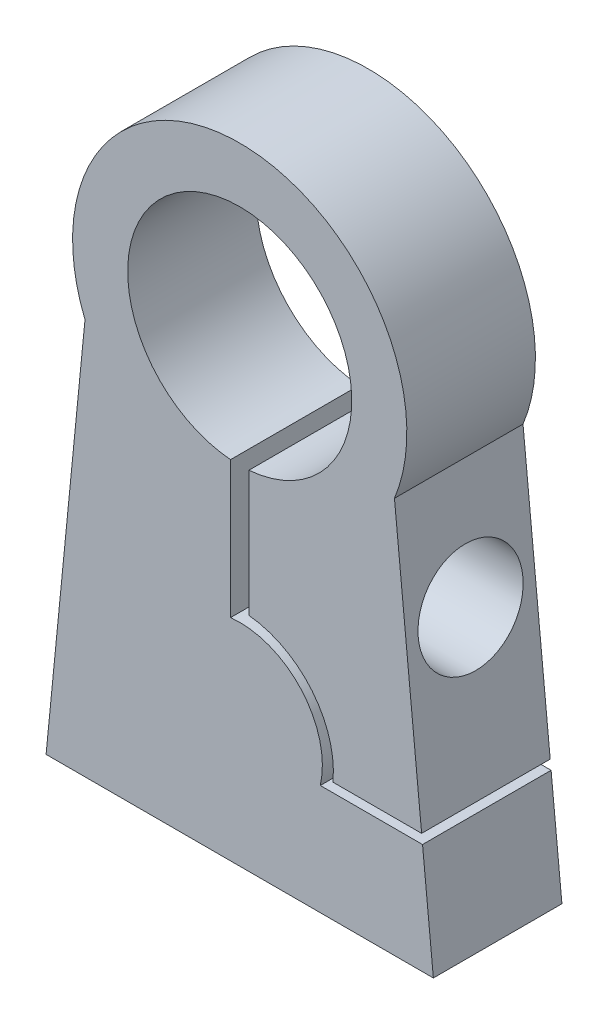
ISO-10303-21;
HEADER;
FILE_DESCRIPTION(('STEP AP214'),'2;1');
FILE_NAME('part.step','',(''),(''),'','','');
FILE_SCHEMA(('AUTOMOTIVE_DESIGN { 1 0 10303 214 1 1 1 1 }'));
ENDSEC;
DATA;
#1=APPLICATION_CONTEXT('core data for automotive mechanical design processes');
#2=APPLICATION_PROTOCOL_DEFINITION('international standard','automotive_design',2000,#1);
#3=PRODUCT_CONTEXT('',#1,'mechanical');
#4=PRODUCT('Part','Part','',(#3));
#5=PRODUCT_RELATED_PRODUCT_CATEGORY('part','',(#4));
#6=PRODUCT_DEFINITION_FORMATION('','',#4);
#7=PRODUCT_DEFINITION_CONTEXT('part definition',#1,'design');
#8=PRODUCT_DEFINITION('design','',#6,#7);
#9=PRODUCT_DEFINITION_SHAPE('','',#8);
#10=(LENGTH_UNIT() NAMED_UNIT(*) SI_UNIT(.MILLI.,.METRE.));
#11=(NAMED_UNIT(*) PLANE_ANGLE_UNIT() SI_UNIT($,.RADIAN.));
#12=(NAMED_UNIT(*) SI_UNIT($,.STERADIAN.) SOLID_ANGLE_UNIT());
#13=UNCERTAINTY_MEASURE_WITH_UNIT(LENGTH_MEASURE(1.E-05),#10,'distance_accuracy_value','');
#14=(GEOMETRIC_REPRESENTATION_CONTEXT(3) GLOBAL_UNCERTAINTY_ASSIGNED_CONTEXT((#13)) GLOBAL_UNIT_ASSIGNED_CONTEXT((#10,
#11,#12)) REPRESENTATION_CONTEXT('',''));
#15=CARTESIAN_POINT('',(0.,0.,0.));
#16=DIRECTION('',(0.,0.,1.));
#17=DIRECTION('',(1.,0.,0.));
#18=AXIS2_PLACEMENT_3D('',#15,#16,#17);
#19=CARTESIAN_POINT('',(13.,-50.,3.5));
#20=DIRECTION('',(-0.99520551532238,-0.0978058396616273,0.));
#21=DIRECTION('',(0.0978058396616273,-0.99520551532238,0.));
#22=AXIS2_PLACEMENT_3D('',#19,#20,#21);
#23=PLANE('',#22);
#24=DIRECTION('',(-0.0978058396616273,0.99520551532238,0.));
#25=VECTOR('',#24,1.);
#26=CARTESIAN_POINT('',(13.,-50.,3.5));
#27=LINE('',#26,#25);
#28=CARTESIAN_POINT('',(10.5430743159129,-25.,3.5));
#29=VERTEX_POINT('',#28);
#30=CARTESIAN_POINT('',(9.953412151732,-19.,3.5));
#31=VERTEX_POINT('',#30);
#32=EDGE_CURVE('E287',#29,#31,#27,.T.);
#33=ORIENTED_EDGE('',*,*,#32,.F.);
#34=DIRECTION('',(0.,0.,-1.));
#35=VECTOR('',#34,1.);
#36=CARTESIAN_POINT('',(10.5430743159129,-25.,3.5));
#37=LINE('',#36,#35);
#38=CARTESIAN_POINT('',(10.5430743159129,-25.,-3.5));
#39=VERTEX_POINT('',#38);
#40=EDGE_CURVE('E298',#29,#39,#37,.T.);
#41=ORIENTED_EDGE('',*,*,#40,.T.);
#42=DIRECTION('',(-0.0978058396616273,0.99520551532238,0.));
#43=VECTOR('',#42,1.);
#44=CARTESIAN_POINT('',(13.,-50.,-3.5));
#45=LINE('',#44,#43);
#46=CARTESIAN_POINT('',(9.95341215173201,-19.,-3.5));
#47=VERTEX_POINT('',#46);
#48=EDGE_CURVE('E230',#39,#47,#45,.T.);
#49=ORIENTED_EDGE('',*,*,#48,.T.);
#50=DIRECTION('',(0.,0.,1.));
#51=VECTOR('',#50,1.);
#52=CARTESIAN_POINT('',(9.95341215173201,-19.,3.5));
#53=LINE('',#52,#51);
#54=EDGE_CURVE('E303',#47,#31,#53,.T.);
#55=ORIENTED_EDGE('',*,*,#54,.T.);
#56=EDGE_LOOP('',(#33,#41,#49,#55));
#57=FACE_BOUND('',#56,.T.);
#58=ADVANCED_FACE('F94',(#57),#23,.F.);
#59=CARTESIAN_POINT('',(0.,0.,3.5));
#60=DIRECTION('',(0.,0.,-1.));
#61=DIRECTION('',(-1.,0.,0.));
#62=AXIS2_PLACEMENT_3D('',#59,#60,#61);
#63=PLANE('',#62);
#64=DIRECTION('',(-0.0978058396616273,-0.99520551532238,0.));
#65=VECTOR('',#64,1.);
#66=CARTESIAN_POINT('',(-13.,-50.,3.5));
#67=LINE('',#66,#65);
#68=CARTESIAN_POINT('',(-8.42432395212559,-3.44104140481383,3.5));
#69=VERTEX_POINT('',#68);
#70=CARTESIAN_POINT('',(-10.5430743159129,-25.,3.5));
#71=VERTEX_POINT('',#70);
#72=EDGE_CURVE('E248',#69,#71,#67,.T.);
#73=ORIENTED_EDGE('',*,*,#72,.T.);
#74=DIRECTION('',(1.,0.,0.));
#75=VECTOR('',#74,1.);
#76=CARTESIAN_POINT('',(0.,-25.,3.5));
#77=LINE('',#76,#75);
#78=EDGE_CURVE('E109',#71,#29,#77,.T.);
#79=ORIENTED_EDGE('',*,*,#78,.T.);
#80=ORIENTED_EDGE('',*,*,#32,.T.);
#81=DIRECTION('',(1.,0.,0.));
#82=VECTOR('',#81,1.);
#83=CARTESIAN_POINT('',(4.,-19.,3.5));
#84=LINE('',#83,#82);
#85=CARTESIAN_POINT('',(4.38748219369606,-19.,3.5));
#86=VERTEX_POINT('',#85);
#87=EDGE_CURVE('E636',#86,#31,#84,.T.);
#88=ORIENTED_EDGE('',*,*,#87,.F.);
#89=CARTESIAN_POINT('',(0.,-18.,3.5));
#90=DIRECTION('',(0.,0.,1.));
#91=DIRECTION('',(1.,0.,0.));
#92=AXIS2_PLACEMENT_3D('',#89,#90,#91);
#93=CIRCLE('',#92,4.5);
#94=CARTESIAN_POINT('',(-0.499999999999999,-13.5278640450004,3.5));
#95=VERTEX_POINT('',#94);
#96=EDGE_CURVE('E386',#86,#95,#93,.T.);
#97=ORIENTED_EDGE('',*,*,#96,.T.);
#98=DIRECTION('',(0.,-1.,0.));
#99=VECTOR('',#98,1.);
#100=CARTESIAN_POINT('',(-0.500000000000001,0.,3.5));
#101=LINE('',#100,#99);
#102=CARTESIAN_POINT('',(-0.5,-6.07947366142827,3.5));
#103=VERTEX_POINT('',#102);
#104=EDGE_CURVE('E366',#103,#95,#101,.T.);
#105=ORIENTED_EDGE('',*,*,#104,.F.);
#106=CARTESIAN_POINT('',(0.,0.,3.5));
#107=DIRECTION('',(0.,0.,1.));
#108=DIRECTION('',(1.,0.,0.));
#109=AXIS2_PLACEMENT_3D('',#106,#107,#108);
#110=CIRCLE('',#109,6.1);
#111=CARTESIAN_POINT('',(0.500000000000001,-6.07947366142827,3.5));
#112=VERTEX_POINT('',#111);
#113=EDGE_CURVE('E236',#112,#103,#110,.T.);
#114=ORIENTED_EDGE('',*,*,#113,.F.);
#115=DIRECTION('',(0.,1.,0.));
#116=VECTOR('',#115,1.);
#117=CARTESIAN_POINT('',(0.500000000000001,0.,3.5));
#118=LINE('',#117,#116);
#119=CARTESIAN_POINT('',(0.500000000000001,-12.9245689838202,3.5));
#120=VERTEX_POINT('',#119);
#121=EDGE_CURVE('E274',#120,#112,#118,.T.);
#122=ORIENTED_EDGE('',*,*,#121,.F.);
#123=CARTESIAN_POINT('',(0.,-18.,3.5));
#124=DIRECTION('',(0.,0.,1.));
#125=DIRECTION('',(1.,0.,0.));
#126=AXIS2_PLACEMENT_3D('',#123,#124,#125);
#127=CIRCLE('',#126,5.1);
#128=CARTESIAN_POINT('',(5.07543101617981,-18.5,3.5));
#129=VERTEX_POINT('',#128);
#130=EDGE_CURVE('E265',#129,#120,#127,.T.);
#131=ORIENTED_EDGE('',*,*,#130,.F.);
#132=DIRECTION('',(-1.,0.,0.));
#133=VECTOR('',#132,1.);
#134=CARTESIAN_POINT('',(4.,-18.5,3.5));
#135=LINE('',#134,#133);
#136=CARTESIAN_POINT('',(9.90427363805026,-18.5,3.5));
#137=VERTEX_POINT('',#136);
#138=EDGE_CURVE('E116',#137,#129,#135,.T.);
#139=ORIENTED_EDGE('',*,*,#138,.F.);
#140=CARTESIAN_POINT('',(8.42432395212559,-3.44104140481383,3.5));
#141=VERTEX_POINT('',#140);
#142=EDGE_CURVE('E286',#137,#141,#27,.T.);
#143=ORIENTED_EDGE('',*,*,#142,.T.);
#144=CARTESIAN_POINT('',(0.,0.,3.5));
#145=DIRECTION('',(0.,0.,1.));
#146=DIRECTION('',(-1.,0.,0.));
#147=AXIS2_PLACEMENT_3D('',#144,#145,#146);
#148=CIRCLE('',#147,9.1);
#149=EDGE_CURVE('E243',#141,#69,#148,.T.);
#150=ORIENTED_EDGE('',*,*,#149,.T.);
#151=EDGE_LOOP('',(#73,#79,#80,#88,#97,#105,#114,#122,#131,#139,#143,#150));
#152=FACE_BOUND('',#151,.T.);
#153=ADVANCED_FACE('F271',(#152),#63,.F.);
#154=CARTESIAN_POINT('',(0.,0.,-3.5));
#155=DIRECTION('',(0.,0.,-1.));
#156=DIRECTION('',(-1.,0.,0.));
#157=AXIS2_PLACEMENT_3D('',#154,#155,#156);
#158=PLANE('',#157);
#159=DIRECTION('',(1.,0.,0.));
#160=VECTOR('',#159,1.);
#161=CARTESIAN_POINT('',(0.,-25.,-3.5));
#162=LINE('',#161,#160);
#163=CARTESIAN_POINT('',(-10.5430743159129,-25.,-3.5));
#164=VERTEX_POINT('',#163);
#165=EDGE_CURVE('E217',#164,#39,#162,.T.);
#166=ORIENTED_EDGE('',*,*,#165,.F.);
#167=DIRECTION('',(-0.0978058396616273,-0.99520551532238,0.));
#168=VECTOR('',#167,1.);
#169=CARTESIAN_POINT('',(-13.,-50.,-3.5));
#170=LINE('',#169,#168);
#171=CARTESIAN_POINT('',(-8.42432395212559,-3.44104140481383,-3.5));
#172=VERTEX_POINT('',#171);
#173=EDGE_CURVE('E228',#172,#164,#170,.T.);
#174=ORIENTED_EDGE('',*,*,#173,.F.);
#175=CARTESIAN_POINT('',(0.,0.,-3.5));
#176=DIRECTION('',(0.,0.,1.));
#177=DIRECTION('',(-1.,0.,0.));
#178=AXIS2_PLACEMENT_3D('',#175,#176,#177);
#179=CIRCLE('',#178,9.1);
#180=CARTESIAN_POINT('',(8.42432395212559,-3.44104140481383,-3.5));
#181=VERTEX_POINT('',#180);
#182=EDGE_CURVE('E246',#181,#172,#179,.T.);
#183=ORIENTED_EDGE('',*,*,#182,.F.);
#184=CARTESIAN_POINT('',(9.90427363805027,-18.5,-3.5));
#185=VERTEX_POINT('',#184);
#186=EDGE_CURVE('E235',#185,#181,#45,.T.);
#187=ORIENTED_EDGE('',*,*,#186,.F.);
#188=DIRECTION('',(-1.,0.,0.));
#189=VECTOR('',#188,1.);
#190=CARTESIAN_POINT('',(4.,-18.5,-3.5));
#191=LINE('',#190,#189);
#192=CARTESIAN_POINT('',(5.07543101617981,-18.5,-3.5));
#193=VERTEX_POINT('',#192);
#194=EDGE_CURVE('E310',#185,#193,#191,.T.);
#195=ORIENTED_EDGE('',*,*,#194,.T.);
#196=CARTESIAN_POINT('',(0.,-18.,-3.5));
#197=DIRECTION('',(0.,0.,-1.));
#198=DIRECTION('',(-1.,0.,0.));
#199=AXIS2_PLACEMENT_3D('',#196,#197,#198);
#200=CIRCLE('',#199,5.1);
#201=CARTESIAN_POINT('',(0.500000000000001,-12.9245689838202,-3.5));
#202=VERTEX_POINT('',#201);
#203=EDGE_CURVE('E267',#193,#202,#200,.F.);
#204=ORIENTED_EDGE('',*,*,#203,.T.);
#205=DIRECTION('',(0.,1.,0.));
#206=VECTOR('',#205,1.);
#207=CARTESIAN_POINT('',(0.500000000000001,0.,-3.5));
#208=LINE('',#207,#206);
#209=CARTESIAN_POINT('',(0.500000000000001,-6.07947366142827,-3.5));
#210=VERTEX_POINT('',#209);
#211=EDGE_CURVE('E368',#202,#210,#208,.T.);
#212=ORIENTED_EDGE('',*,*,#211,.T.);
#213=CARTESIAN_POINT('',(0.,0.,-3.5));
#214=DIRECTION('',(0.,0.,1.));
#215=DIRECTION('',(1.,0.,0.));
#216=AXIS2_PLACEMENT_3D('',#213,#214,#215);
#217=CIRCLE('',#216,6.1);
#218=CARTESIAN_POINT('',(-0.5,-6.07947366142827,-3.5));
#219=VERTEX_POINT('',#218);
#220=EDGE_CURVE('E240',#210,#219,#217,.T.);
#221=ORIENTED_EDGE('',*,*,#220,.T.);
#222=DIRECTION('',(0.,-1.,0.));
#223=VECTOR('',#222,1.);
#224=CARTESIAN_POINT('',(-0.500000000000001,0.,-3.5));
#225=LINE('',#224,#223);
#226=CARTESIAN_POINT('',(-0.499999999999999,-13.5278640450004,-3.5));
#227=VERTEX_POINT('',#226);
#228=EDGE_CURVE('E373',#219,#227,#225,.T.);
#229=ORIENTED_EDGE('',*,*,#228,.T.);
#230=CARTESIAN_POINT('',(0.,-18.,-3.5));
#231=DIRECTION('',(0.,0.,1.));
#232=DIRECTION('',(1.,0.,0.));
#233=AXIS2_PLACEMENT_3D('',#230,#231,#232);
#234=CIRCLE('',#233,4.5);
#235=CARTESIAN_POINT('',(4.38748219369606,-19.,-3.5));
#236=VERTEX_POINT('',#235);
#237=EDGE_CURVE('E627',#236,#227,#234,.T.);
#238=ORIENTED_EDGE('',*,*,#237,.F.);
#239=DIRECTION('',(1.,0.,0.));
#240=VECTOR('',#239,1.);
#241=CARTESIAN_POINT('',(4.,-19.,-3.5));
#242=LINE('',#241,#240);
#243=EDGE_CURVE('E638',#236,#47,#242,.T.);
#244=ORIENTED_EDGE('',*,*,#243,.T.);
#245=ORIENTED_EDGE('',*,*,#48,.F.);
#246=EDGE_LOOP('',(#166,#174,#183,#187,#195,#204,#212,#221,#229,#238,#244,#245));
#247=FACE_BOUND('',#246,.T.);
#248=ADVANCED_FACE('F226',(#247),#158,.T.);
#249=CARTESIAN_POINT('',(-13.,-50.,3.5));
#250=DIRECTION('',(0.99520551532238,-0.0978058396616273,0.));
#251=DIRECTION('',(0.0978058396616273,0.99520551532238,0.));
#252=AXIS2_PLACEMENT_3D('',#249,#250,#251);
#253=PLANE('',#252);
#254=ORIENTED_EDGE('',*,*,#173,.T.);
#255=DIRECTION('',(0.,0.,1.));
#256=VECTOR('',#255,1.);
#257=CARTESIAN_POINT('',(-10.5430743159129,-25.,3.5));
#258=LINE('',#257,#256);
#259=EDGE_CURVE('E12',#164,#71,#258,.T.);
#260=ORIENTED_EDGE('',*,*,#259,.T.);
#261=ORIENTED_EDGE('',*,*,#72,.F.);
#262=DIRECTION('',(0.,0.,-1.));
#263=VECTOR('',#262,1.);
#264=CARTESIAN_POINT('',(-8.42432395212559,-3.44104140481383,3.5));
#265=LINE('',#264,#263);
#266=EDGE_CURVE('E234',#69,#172,#265,.T.);
#267=ORIENTED_EDGE('',*,*,#266,.T.);
#268=EDGE_LOOP('',(#254,#260,#261,#267));
#269=FACE_BOUND('',#268,.T.);
#270=ADVANCED_FACE('F96',(#269),#253,.F.);
#271=CARTESIAN_POINT('',(9.06891890546066,-10.,0.));
#272=DIRECTION('',(-0.99520551532238,-0.0978058396616273,0.));
#273=DIRECTION('',(-0.0978058396616273,0.99520551532238,0.));
#274=AXIS2_PLACEMENT_3D('',#271,#272,#273);
#275=ELLIPSE('',#274,2.86373011013388,2.85);
#276=CARTESIAN_POINT('',(8.78882937747473,-7.15,0.));
#277=VERTEX_POINT('',#276);
#278=EDGE_CURVE('E259',#277,#277,#275,.F.);
#279=ORIENTED_EDGE('',*,*,#278,.F.);
#280=EDGE_LOOP('',(#279));
#281=FACE_BOUND('',#280,.T.);
#282=ORIENTED_EDGE('',*,*,#142,.F.);
#283=DIRECTION('',(0.,0.,-1.));
#284=VECTOR('',#283,1.);
#285=CARTESIAN_POINT('',(9.90427363805027,-18.5,3.5));
#286=LINE('',#285,#284);
#287=EDGE_CURVE('E306',#137,#185,#286,.T.);
#288=ORIENTED_EDGE('',*,*,#287,.T.);
#289=ORIENTED_EDGE('',*,*,#186,.T.);
#290=DIRECTION('',(0.,0.,-1.));
#291=VECTOR('',#290,1.);
#292=CARTESIAN_POINT('',(8.42432395212559,-3.44104140481383,3.5));
#293=LINE('',#292,#291);
#294=EDGE_CURVE('E250',#141,#181,#293,.T.);
#295=ORIENTED_EDGE('',*,*,#294,.F.);
#296=EDGE_LOOP('',(#282,#288,#289,#295));
#297=FACE_BOUND('',#296,.T.);
#298=ADVANCED_FACE('F294',(#281,#297),#23,.F.);
#299=CARTESIAN_POINT('',(0.,0.,3.5));
#300=DIRECTION('',(0.,0.,-1.));
#301=DIRECTION('',(-1.,0.,0.));
#302=AXIS2_PLACEMENT_3D('',#299,#300,#301);
#303=CYLINDRICAL_SURFACE('',#302,9.1);
#304=ORIENTED_EDGE('',*,*,#182,.T.);
#305=ORIENTED_EDGE('',*,*,#266,.F.);
#306=ORIENTED_EDGE('',*,*,#149,.F.);
#307=ORIENTED_EDGE('',*,*,#294,.T.);
#308=EDGE_LOOP('',(#304,#305,#306,#307));
#309=FACE_BOUND('',#308,.T.);
#310=ADVANCED_FACE('F297',(#309),#303,.T.);
#311=CARTESIAN_POINT('',(0.,0.,3.5));
#312=DIRECTION('',(0.,0.,-1.));
#313=DIRECTION('',(-1.,0.,0.));
#314=AXIS2_PLACEMENT_3D('',#311,#312,#313);
#315=CYLINDRICAL_SURFACE('',#314,6.1);
#316=DIRECTION('',(0.,0.,1.));
#317=VECTOR('',#316,1.);
#318=CARTESIAN_POINT('',(0.500000000000001,-6.07947366142827,-17.9249783362056));
#319=LINE('',#318,#317);
#320=EDGE_CURVE('E372',#210,#112,#319,.T.);
#321=ORIENTED_EDGE('',*,*,#320,.T.);
#322=ORIENTED_EDGE('',*,*,#113,.T.);
#323=DIRECTION('',(0.,0.,1.));
#324=VECTOR('',#323,1.);
#325=CARTESIAN_POINT('',(-0.5,-6.07947366142827,-17.9249783362056));
#326=LINE('',#325,#324);
#327=EDGE_CURVE('E375',#219,#103,#326,.T.);
#328=ORIENTED_EDGE('',*,*,#327,.F.);
#329=ORIENTED_EDGE('',*,*,#220,.F.);
#330=EDGE_LOOP('',(#321,#322,#328,#329));
#331=FACE_BOUND('',#330,.T.);
#332=ADVANCED_FACE('F379',(#331),#315,.F.);
#333=CARTESIAN_POINT('',(0.500000000000001,0.,-17.9249783362056));
#334=DIRECTION('',(1.,0.,0.));
#335=DIRECTION('',(0.,1.,0.));
#336=AXIS2_PLACEMENT_3D('',#333,#334,#335);
#337=PLANE('',#336);
#338=CARTESIAN_POINT('',(0.5,-10.,0.));
#339=DIRECTION('',(1.,0.,0.));
#340=DIRECTION('',(0.,1.,0.));
#341=AXIS2_PLACEMENT_3D('',#338,#339,#340);
#342=CIRCLE('',#341,1.55);
#343=CARTESIAN_POINT('',(0.5,-8.45,0.));
#344=VERTEX_POINT('',#343);
#345=EDGE_CURVE('E318',#344,#344,#342,.F.);
#346=ORIENTED_EDGE('',*,*,#345,.F.);
#347=EDGE_LOOP('',(#346));
#348=FACE_BOUND('',#347,.T.);
#349=DIRECTION('',(0.,0.,1.));
#350=VECTOR('',#349,1.);
#351=CARTESIAN_POINT('',(0.500000000000001,-12.9245689838202,-17.9249783362056));
#352=LINE('',#351,#350);
#353=EDGE_CURVE('E281',#202,#120,#352,.T.);
#354=ORIENTED_EDGE('',*,*,#353,.T.);
#355=ORIENTED_EDGE('',*,*,#121,.T.);
#356=ORIENTED_EDGE('',*,*,#320,.F.);
#357=ORIENTED_EDGE('',*,*,#211,.F.);
#358=EDGE_LOOP('',(#354,#355,#356,#357));
#359=FACE_BOUND('',#358,.T.);
#360=ADVANCED_FACE('F394',(#348,#359),#337,.F.);
#361=CARTESIAN_POINT('',(-0.500000000000001,0.,-17.9249783362056));
#362=DIRECTION('',(-1.,0.,0.));
#363=DIRECTION('',(0.,-1.,0.));
#364=AXIS2_PLACEMENT_3D('',#361,#362,#363);
#365=PLANE('',#364);
#366=CARTESIAN_POINT('',(-0.499999999999999,-10.,0.));
#367=DIRECTION('',(-1.,0.,0.));
#368=DIRECTION('',(0.,-1.,0.));
#369=AXIS2_PLACEMENT_3D('',#366,#367,#368);
#370=CIRCLE('',#369,1.55);
#371=CARTESIAN_POINT('',(-0.499999999999999,-11.55,0.));
#372=VERTEX_POINT('',#371);
#373=EDGE_CURVE('E256',#372,#372,#370,.F.);
#374=ORIENTED_EDGE('',*,*,#373,.F.);
#375=EDGE_LOOP('',(#374));
#376=FACE_BOUND('',#375,.T.);
#377=ORIENTED_EDGE('',*,*,#327,.T.);
#378=ORIENTED_EDGE('',*,*,#104,.T.);
#379=DIRECTION('',(0.,0.,-1.));
#380=VECTOR('',#379,1.);
#381=CARTESIAN_POINT('',(-0.499999999999999,-13.5278640450004,3.5));
#382=LINE('',#381,#380);
#383=EDGE_CURVE('E391',#95,#227,#382,.T.);
#384=ORIENTED_EDGE('',*,*,#383,.T.);
#385=ORIENTED_EDGE('',*,*,#228,.F.);
#386=EDGE_LOOP('',(#377,#378,#384,#385));
#387=FACE_BOUND('',#386,.T.);
#388=ADVANCED_FACE('F390',(#376,#387),#365,.F.);
#389=CARTESIAN_POINT('',(0.,-18.,-17.9249783362056));
#390=DIRECTION('',(0.,0.,1.));
#391=DIRECTION('',(1.,0.,0.));
#392=AXIS2_PLACEMENT_3D('',#389,#390,#391);
#393=CYLINDRICAL_SURFACE('',#392,5.1);
#394=ORIENTED_EDGE('',*,*,#203,.F.);
#395=DIRECTION('',(0.,0.,1.));
#396=VECTOR('',#395,1.);
#397=CARTESIAN_POINT('',(5.07543101617981,-18.5,-17.9249783362056));
#398=LINE('',#397,#396);
#399=EDGE_CURVE('E102',#193,#129,#398,.T.);
#400=ORIENTED_EDGE('',*,*,#399,.T.);
#401=ORIENTED_EDGE('',*,*,#130,.T.);
#402=ORIENTED_EDGE('',*,*,#353,.F.);
#403=EDGE_LOOP('',(#394,#400,#401,#402));
#404=FACE_BOUND('',#403,.T.);
#405=ADVANCED_FACE('F263',(#404),#393,.F.);
#406=CARTESIAN_POINT('',(13.4635412391136,-10.,0.));
#407=DIRECTION('',(-1.,0.,0.));
#408=DIRECTION('',(0.,-1.,0.));
#409=AXIS2_PLACEMENT_3D('',#406,#407,#408);
#410=CYLINDRICAL_SURFACE('',#409,1.55);
#411=CARTESIAN_POINT('',(-2.5,-10.,0.));
#412=DIRECTION('',(1.,0.,0.));
#413=DIRECTION('',(0.,1.,0.));
#414=AXIS2_PLACEMENT_3D('',#411,#412,#413);
#415=CIRCLE('',#414,1.55);
#416=CARTESIAN_POINT('',(-2.5,-8.45,0.));
#417=VERTEX_POINT('',#416);
#418=EDGE_CURVE('E253',#417,#417,#415,.F.);
#419=ORIENTED_EDGE('',*,*,#418,.T.);
#420=EDGE_LOOP('',(#419));
#421=FACE_BOUND('',#420,.T.);
#422=ORIENTED_EDGE('',*,*,#373,.T.);
#423=EDGE_LOOP('',(#422));
#424=FACE_BOUND('',#423,.T.);
#425=ADVANCED_FACE('F404',(#421,#424),#410,.F.);
#426=CARTESIAN_POINT('',(3.,-10.,0.));
#427=DIRECTION('',(-1.,0.,0.));
#428=DIRECTION('',(0.,-1.,0.));
#429=AXIS2_PLACEMENT_3D('',#426,#427,#428);
#430=CIRCLE('',#429,1.55);
#431=CARTESIAN_POINT('',(3.,-11.55,0.));
#432=VERTEX_POINT('',#431);
#433=EDGE_CURVE('E257',#432,#432,#430,.T.);
#434=ORIENTED_EDGE('',*,*,#433,.F.);
#435=EDGE_LOOP('',(#434));
#436=FACE_BOUND('',#435,.T.);
#437=ORIENTED_EDGE('',*,*,#345,.T.);
#438=EDGE_LOOP('',(#437));
#439=FACE_BOUND('',#438,.T.);
#440=ADVANCED_FACE('F444',(#436,#439),#410,.F.);
#441=CARTESIAN_POINT('',(-5.1,-6.70910346561914,0.));
#442=DIRECTION('',(0.,1.,0.));
#443=DIRECTION('',(0.,0.,1.));
#444=AXIS2_PLACEMENT_3D('',#441,#442,#443);
#445=PLANE('',#444);
#446=DIRECTION('',(0.,0.,1.));
#447=VECTOR('',#446,1.);
#448=CARTESIAN_POINT('',(-2.5,-6.70910346561914,0.));
#449=LINE('',#448,#447);
#450=CARTESIAN_POINT('',(-2.5,-6.70910346561914,0.));
#451=VERTEX_POINT('',#450);
#452=CARTESIAN_POINT('',(-2.5,-6.70910346561914,2.85));
#453=VERTEX_POINT('',#452);
#454=EDGE_CURVE('E321',#451,#453,#449,.T.);
#455=ORIENTED_EDGE('',*,*,#454,.T.);
#456=DIRECTION('',(1.,0.,0.));
#457=VECTOR('',#456,1.);
#458=CARTESIAN_POINT('',(-5.1,-6.70910346561914,2.85));
#459=LINE('',#458,#457);
#460=CARTESIAN_POINT('',(-5.1,-6.70910346561914,2.85));
#461=VERTEX_POINT('',#460);
#462=EDGE_CURVE('E341',#461,#453,#459,.T.);
#463=ORIENTED_EDGE('',*,*,#462,.F.);
#464=DIRECTION('',(0.,0.,1.));
#465=VECTOR('',#464,1.);
#466=CARTESIAN_POINT('',(-5.1,-6.70910346561914,0.));
#467=LINE('',#466,#465);
#468=CARTESIAN_POINT('',(-5.1,-6.70910346561914,0.));
#469=VERTEX_POINT('',#468);
#470=EDGE_CURVE('E322',#469,#461,#467,.T.);
#471=ORIENTED_EDGE('',*,*,#470,.F.);
#472=DIRECTION('',(1.,0.,0.));
#473=VECTOR('',#472,1.);
#474=CARTESIAN_POINT('',(-5.1,-6.70910346561914,0.));
#475=LINE('',#474,#473);
#476=EDGE_CURVE('E275',#469,#451,#475,.T.);
#477=ORIENTED_EDGE('',*,*,#476,.T.);
#478=EDGE_LOOP('',(#455,#463,#471,#477));
#479=FACE_BOUND('',#478,.T.);
#480=ADVANCED_FACE('F447',(#479),#445,.F.);
#481=CARTESIAN_POINT('',(-5.1,-8.35455173280957,-2.85));
#482=DIRECTION('',(0.,0.866025403784438,-0.5));
#483=DIRECTION('',(0.,0.5,0.866025403784439));
#484=AXIS2_PLACEMENT_3D('',#481,#482,#483);
#485=PLANE('',#484);
#486=DIRECTION('',(0.,0.5,0.866025403784438));
#487=VECTOR('',#486,1.);
#488=CARTESIAN_POINT('',(-2.5,-8.35455173280957,-2.85));
#489=LINE('',#488,#487);
#490=CARTESIAN_POINT('',(-2.5,-8.35455173280957,-2.85));
#491=VERTEX_POINT('',#490);
#492=EDGE_CURVE('E326',#491,#451,#489,.T.);
#493=ORIENTED_EDGE('',*,*,#492,.T.);
#494=ORIENTED_EDGE('',*,*,#476,.F.);
#495=DIRECTION('',(0.,0.5,0.866025403784438));
#496=VECTOR('',#495,1.);
#497=CARTESIAN_POINT('',(-5.1,-8.35455173280957,-2.85));
#498=LINE('',#497,#496);
#499=CARTESIAN_POINT('',(-5.1,-8.35455173280957,-2.85));
#500=VERTEX_POINT('',#499);
#501=EDGE_CURVE('E338',#500,#469,#498,.T.);
#502=ORIENTED_EDGE('',*,*,#501,.F.);
#503=DIRECTION('',(1.,0.,0.));
#504=VECTOR('',#503,1.);
#505=CARTESIAN_POINT('',(-5.1,-8.35455173280957,-2.85));
#506=LINE('',#505,#504);
#507=EDGE_CURVE('E278',#500,#491,#506,.T.);
#508=ORIENTED_EDGE('',*,*,#507,.T.);
#509=EDGE_LOOP('',(#493,#494,#502,#508));
#510=FACE_BOUND('',#509,.T.);
#511=ADVANCED_FACE('F457',(#510),#485,.F.);
#512=CARTESIAN_POINT('',(-5.1,-11.6454482671904,-2.85));
#513=DIRECTION('',(0.,0.,-1.));
#514=DIRECTION('',(0.,1.,0.));
#515=AXIS2_PLACEMENT_3D('',#512,#513,#514);
#516=PLANE('',#515);
#517=DIRECTION('',(0.,1.,0.));
#518=VECTOR('',#517,1.);
#519=CARTESIAN_POINT('',(-2.5,-11.6454482671904,-2.85));
#520=LINE('',#519,#518);
#521=CARTESIAN_POINT('',(-2.5,-11.6454482671904,-2.85));
#522=VERTEX_POINT('',#521);
#523=EDGE_CURVE('E353',#522,#491,#520,.T.);
#524=ORIENTED_EDGE('',*,*,#523,.T.);
#525=ORIENTED_EDGE('',*,*,#507,.F.);
#526=DIRECTION('',(0.,1.,0.));
#527=VECTOR('',#526,1.);
#528=CARTESIAN_POINT('',(-5.1,-11.6454482671904,-2.85));
#529=LINE('',#528,#527);
#530=CARTESIAN_POINT('',(-5.1,-11.6454482671904,-2.85));
#531=VERTEX_POINT('',#530);
#532=EDGE_CURVE('E335',#531,#500,#529,.T.);
#533=ORIENTED_EDGE('',*,*,#532,.F.);
#534=DIRECTION('',(1.,0.,0.));
#535=VECTOR('',#534,1.);
#536=CARTESIAN_POINT('',(-5.1,-11.6454482671904,-2.85));
#537=LINE('',#536,#535);
#538=EDGE_CURVE('E359',#531,#522,#537,.T.);
#539=ORIENTED_EDGE('',*,*,#538,.T.);
#540=EDGE_LOOP('',(#524,#525,#533,#539));
#541=FACE_BOUND('',#540,.T.);
#542=ADVANCED_FACE('F460',(#541),#516,.F.);
#543=CARTESIAN_POINT('',(-5.1,-13.2908965343809,0.));
#544=DIRECTION('',(0.,-0.866025403784439,-0.5));
#545=DIRECTION('',(0.,0.5,-0.866025403784439));
#546=AXIS2_PLACEMENT_3D('',#543,#544,#545);
#547=PLANE('',#546);
#548=DIRECTION('',(0.,0.5,-0.866025403784439));
#549=VECTOR('',#548,1.);
#550=CARTESIAN_POINT('',(-2.5,-13.2908965343809,0.));
#551=LINE('',#550,#549);
#552=CARTESIAN_POINT('',(-2.5,-13.2908965343809,0.));
#553=VERTEX_POINT('',#552);
#554=EDGE_CURVE('E350',#553,#522,#551,.T.);
#555=ORIENTED_EDGE('',*,*,#554,.T.);
#556=ORIENTED_EDGE('',*,*,#538,.F.);
#557=DIRECTION('',(0.,0.5,-0.866025403784439));
#558=VECTOR('',#557,1.);
#559=CARTESIAN_POINT('',(-5.1,-13.2908965343809,0.));
#560=LINE('',#559,#558);
#561=CARTESIAN_POINT('',(-5.1,-13.2908965343809,0.));
#562=VERTEX_POINT('',#561);
#563=EDGE_CURVE('E332',#562,#531,#560,.T.);
#564=ORIENTED_EDGE('',*,*,#563,.F.);
#565=DIRECTION('',(1.,0.,0.));
#566=VECTOR('',#565,1.);
#567=CARTESIAN_POINT('',(-5.1,-13.2908965343809,0.));
#568=LINE('',#567,#566);
#569=EDGE_CURVE('E361',#562,#553,#568,.T.);
#570=ORIENTED_EDGE('',*,*,#569,.T.);
#571=EDGE_LOOP('',(#555,#556,#564,#570));
#572=FACE_BOUND('',#571,.T.);
#573=ADVANCED_FACE('F464',(#572),#547,.F.);
#574=CARTESIAN_POINT('',(-5.1,-13.2908965343809,2.85));
#575=DIRECTION('',(0.,-1.,0.));
#576=DIRECTION('',(0.,0.,-1.));
#577=AXIS2_PLACEMENT_3D('',#574,#575,#576);
#578=PLANE('',#577);
#579=DIRECTION('',(0.,0.,-1.));
#580=VECTOR('',#579,1.);
#581=CARTESIAN_POINT('',(-2.5,-13.2908965343809,2.85));
#582=LINE('',#581,#580);
#583=CARTESIAN_POINT('',(-2.5,-13.2908965343809,2.85));
#584=VERTEX_POINT('',#583);
#585=EDGE_CURVE('E347',#584,#553,#582,.T.);
#586=ORIENTED_EDGE('',*,*,#585,.T.);
#587=ORIENTED_EDGE('',*,*,#569,.F.);
#588=DIRECTION('',(0.,0.,-1.));
#589=VECTOR('',#588,1.);
#590=CARTESIAN_POINT('',(-5.1,-13.2908965343809,2.85));
#591=LINE('',#590,#589);
#592=CARTESIAN_POINT('',(-5.1,-13.2908965343809,2.85));
#593=VERTEX_POINT('',#592);
#594=EDGE_CURVE('E329',#593,#562,#591,.T.);
#595=ORIENTED_EDGE('',*,*,#594,.F.);
#596=DIRECTION('',(1.,0.,0.));
#597=VECTOR('',#596,1.);
#598=CARTESIAN_POINT('',(-5.1,-13.2908965343809,2.85));
#599=LINE('',#598,#597);
#600=EDGE_CURVE('E363',#593,#584,#599,.T.);
#601=ORIENTED_EDGE('',*,*,#600,.T.);
#602=EDGE_LOOP('',(#586,#587,#595,#601));
#603=FACE_BOUND('',#602,.T.);
#604=ADVANCED_FACE('F468',(#603),#578,.F.);
#605=CARTESIAN_POINT('',(-5.1,-6.70910346561914,2.85));
#606=DIRECTION('',(0.,0.,1.));
#607=DIRECTION('',(0.,-1.,0.));
#608=AXIS2_PLACEMENT_3D('',#605,#606,#607);
#609=PLANE('',#608);
#610=DIRECTION('',(0.,-1.,0.));
#611=VECTOR('',#610,1.);
#612=CARTESIAN_POINT('',(-2.5,-6.70910346561914,2.85));
#613=LINE('',#612,#611);
#614=EDGE_CURVE('E344',#453,#584,#613,.T.);
#615=ORIENTED_EDGE('',*,*,#614,.T.);
#616=ORIENTED_EDGE('',*,*,#600,.F.);
#617=DIRECTION('',(0.,-1.,0.));
#618=VECTOR('',#617,1.);
#619=CARTESIAN_POINT('',(-5.1,-6.70910346561914,2.85));
#620=LINE('',#619,#618);
#621=EDGE_CURVE('E325',#461,#593,#620,.T.);
#622=ORIENTED_EDGE('',*,*,#621,.F.);
#623=ORIENTED_EDGE('',*,*,#462,.T.);
#624=EDGE_LOOP('',(#615,#616,#622,#623));
#625=FACE_BOUND('',#624,.T.);
#626=ADVANCED_FACE('F452',(#625),#609,.F.);
#627=CARTESIAN_POINT('',(-5.1,0.,0.));
#628=DIRECTION('',(1.,0.,0.));
#629=DIRECTION('',(0.,1.,0.));
#630=AXIS2_PLACEMENT_3D('',#627,#628,#629);
#631=PLANE('',#630);
#632=ORIENTED_EDGE('',*,*,#470,.T.);
#633=ORIENTED_EDGE('',*,*,#621,.T.);
#634=ORIENTED_EDGE('',*,*,#594,.T.);
#635=ORIENTED_EDGE('',*,*,#563,.T.);
#636=ORIENTED_EDGE('',*,*,#532,.T.);
#637=ORIENTED_EDGE('',*,*,#501,.T.);
#638=EDGE_LOOP('',(#632,#633,#634,#635,#636,#637));
#639=FACE_BOUND('',#638,.T.);
#640=ADVANCED_FACE('F449',(#639),#631,.T.);
#641=CARTESIAN_POINT('',(-2.5,0.,0.));
#642=DIRECTION('',(1.,0.,0.));
#643=DIRECTION('',(0.,1.,0.));
#644=AXIS2_PLACEMENT_3D('',#641,#642,#643);
#645=PLANE('',#644);
#646=ORIENTED_EDGE('',*,*,#418,.F.);
#647=EDGE_LOOP('',(#646));
#648=FACE_BOUND('',#647,.T.);
#649=ORIENTED_EDGE('',*,*,#454,.F.);
#650=ORIENTED_EDGE('',*,*,#492,.F.);
#651=ORIENTED_EDGE('',*,*,#523,.F.);
#652=ORIENTED_EDGE('',*,*,#554,.F.);
#653=ORIENTED_EDGE('',*,*,#585,.F.);
#654=ORIENTED_EDGE('',*,*,#614,.F.);
#655=EDGE_LOOP('',(#649,#650,#651,#652,#653,#654));
#656=FACE_BOUND('',#655,.T.);
#657=ADVANCED_FACE('F429',(#648,#656),#645,.F.);
#658=CARTESIAN_POINT('',(17.1493535189515,-10.,0.));
#659=DIRECTION('',(-1.,0.,0.));
#660=DIRECTION('',(0.,-1.,0.));
#661=AXIS2_PLACEMENT_3D('',#658,#659,#660);
#662=CYLINDRICAL_SURFACE('',#661,2.85);
#663=ORIENTED_EDGE('',*,*,#278,.T.);
#664=EDGE_LOOP('',(#663));
#665=FACE_BOUND('',#664,.T.);
#666=CARTESIAN_POINT('',(3.,-10.,0.));
#667=DIRECTION('',(-1.,0.,0.));
#668=DIRECTION('',(0.,-1.,0.));
#669=AXIS2_PLACEMENT_3D('',#666,#667,#668);
#670=CIRCLE('',#669,2.85);
#671=CARTESIAN_POINT('',(3.,-12.85,0.));
#672=VERTEX_POINT('',#671);
#673=EDGE_CURVE('E305',#672,#672,#670,.T.);
#674=ORIENTED_EDGE('',*,*,#673,.T.);
#675=EDGE_LOOP('',(#674));
#676=FACE_BOUND('',#675,.T.);
#677=ADVANCED_FACE('F425',(#665,#676),#662,.F.);
#678=CARTESIAN_POINT('',(3.,-10.,0.));
#679=DIRECTION('',(-1.,0.,0.));
#680=DIRECTION('',(0.,-1.,0.));
#681=AXIS2_PLACEMENT_3D('',#678,#679,#680);
#682=PLANE('',#681);
#683=ORIENTED_EDGE('',*,*,#433,.T.);
#684=EDGE_LOOP('',(#683));
#685=FACE_BOUND('',#684,.T.);
#686=ORIENTED_EDGE('',*,*,#673,.F.);
#687=EDGE_LOOP('',(#686));
#688=FACE_BOUND('',#687,.T.);
#689=ADVANCED_FACE('F428',(#685,#688),#682,.F.);
#690=CARTESIAN_POINT('',(4.,-18.5,-10.5178344238091));
#691=DIRECTION('',(0.,1.,0.));
#692=DIRECTION('',(0.,0.,1.));
#693=AXIS2_PLACEMENT_3D('',#690,#691,#692);
#694=PLANE('',#693);
#695=ORIENTED_EDGE('',*,*,#138,.T.);
#696=ORIENTED_EDGE('',*,*,#399,.F.);
#697=ORIENTED_EDGE('',*,*,#194,.F.);
#698=ORIENTED_EDGE('',*,*,#287,.F.);
#699=EDGE_LOOP('',(#695,#696,#697,#698));
#700=FACE_BOUND('',#699,.T.);
#701=ADVANCED_FACE('F434',(#700),#694,.F.);
#702=CARTESIAN_POINT('',(4.,-19.,-10.5178344238091));
#703=DIRECTION('',(0.,-1.,0.));
#704=DIRECTION('',(0.,0.,-1.));
#705=AXIS2_PLACEMENT_3D('',#702,#703,#704);
#706=PLANE('',#705);
#707=ORIENTED_EDGE('',*,*,#243,.F.);
#708=DIRECTION('',(0.,0.,-1.));
#709=VECTOR('',#708,1.);
#710=CARTESIAN_POINT('',(4.38748219369606,-19.,3.5));
#711=LINE('',#710,#709);
#712=EDGE_CURVE('E629',#86,#236,#711,.T.);
#713=ORIENTED_EDGE('',*,*,#712,.F.);
#714=ORIENTED_EDGE('',*,*,#87,.T.);
#715=ORIENTED_EDGE('',*,*,#54,.F.);
#716=EDGE_LOOP('',(#707,#713,#714,#715));
#717=FACE_BOUND('',#716,.T.);
#718=ADVANCED_FACE('F440',(#717),#706,.F.);
#719=CARTESIAN_POINT('',(0.,-18.,3.5));
#720=DIRECTION('',(0.,0.,-1.));
#721=DIRECTION('',(-1.,0.,0.));
#722=AXIS2_PLACEMENT_3D('',#719,#720,#721);
#723=CYLINDRICAL_SURFACE('',#722,4.5);
#724=ORIENTED_EDGE('',*,*,#237,.T.);
#725=ORIENTED_EDGE('',*,*,#383,.F.);
#726=ORIENTED_EDGE('',*,*,#96,.F.);
#727=ORIENTED_EDGE('',*,*,#712,.T.);
#728=EDGE_LOOP('',(#724,#725,#726,#727));
#729=FACE_BOUND('',#728,.T.);
#730=ADVANCED_FACE('F572',(#729),#723,.T.);
#731=CARTESIAN_POINT('',(0.,-25.,0.));
#732=DIRECTION('',(0.,1.,0.));
#733=DIRECTION('',(0.,0.,1.));
#734=AXIS2_PLACEMENT_3D('',#731,#732,#733);
#735=PLANE('',#734);
#736=ORIENTED_EDGE('',*,*,#78,.F.);
#737=ORIENTED_EDGE('',*,*,#259,.F.);
#738=ORIENTED_EDGE('',*,*,#165,.T.);
#739=ORIENTED_EDGE('',*,*,#40,.F.);
#740=EDGE_LOOP('',(#736,#737,#738,#739));
#741=FACE_BOUND('',#740,.T.);
#742=ADVANCED_FACE('F216',(#741),#735,.F.);
#743=CLOSED_SHELL('',(#58,#153,#248,#270,#298,#310,#332,#360,#388,#405,#425,#440,#480,#511,#542,
#573,#604,#626,#640,#657,#677,#689,#701,#718,#730,#742));
#744=MANIFOLD_SOLID_BREP('B2',#743);
#745=ADVANCED_BREP_SHAPE_REPRESENTATION('',(#18,#744),#14);
#746=SHAPE_DEFINITION_REPRESENTATION(#9,#745);
ENDSEC;
END-ISO-10303-21;
